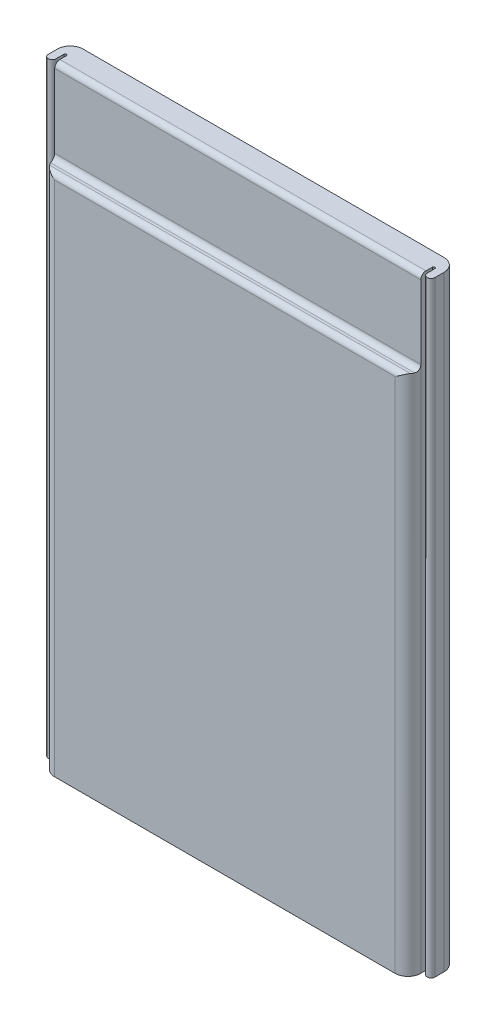
ISO-10303-21;
HEADER;
FILE_DESCRIPTION(('STEP AP214'),'2;1');
FILE_NAME('part.step','',(''),(''),'','','');
FILE_SCHEMA(('AUTOMOTIVE_DESIGN { 1 0 10303 214 1 1 1 1 }'));
ENDSEC;
DATA;
#1=APPLICATION_CONTEXT('core data for automotive mechanical design processes');
#2=APPLICATION_PROTOCOL_DEFINITION('international standard','automotive_design',2000,#1);
#3=PRODUCT_CONTEXT('',#1,'mechanical');
#4=PRODUCT('Part','Part','',(#3));
#5=PRODUCT_RELATED_PRODUCT_CATEGORY('part','',(#4));
#6=PRODUCT_DEFINITION_FORMATION('','',#4);
#7=PRODUCT_DEFINITION_CONTEXT('part definition',#1,'design');
#8=PRODUCT_DEFINITION('design','',#6,#7);
#9=PRODUCT_DEFINITION_SHAPE('','',#8);
#10=(LENGTH_UNIT() NAMED_UNIT(*) SI_UNIT(.MILLI.,.METRE.));
#11=(NAMED_UNIT(*) PLANE_ANGLE_UNIT() SI_UNIT($,.RADIAN.));
#12=(NAMED_UNIT(*) SI_UNIT($,.STERADIAN.) SOLID_ANGLE_UNIT());
#13=UNCERTAINTY_MEASURE_WITH_UNIT(LENGTH_MEASURE(1.E-05),#10,'distance_accuracy_value','');
#14=(GEOMETRIC_REPRESENTATION_CONTEXT(3) GLOBAL_UNCERTAINTY_ASSIGNED_CONTEXT((#13)) GLOBAL_UNIT_ASSIGNED_CONTEXT((#10,
#11,#12)) REPRESENTATION_CONTEXT('',''));
#15=CARTESIAN_POINT('',(0.,0.,0.));
#16=DIRECTION('',(0.,0.,1.));
#17=DIRECTION('',(1.,0.,0.));
#18=AXIS2_PLACEMENT_3D('',#15,#16,#17);
#19=CARTESIAN_POINT('',(-14.2,23.5,2.));
#20=DIRECTION('',(1.,0.,0.));
#21=DIRECTION('',(0.,0.,-1.));
#22=AXIS2_PLACEMENT_3D('',#19,#20,#21);
#23=PLANE('',#22);
#24=CARTESIAN_POINT('',(-14.2,23.1,1.6));
#25=DIRECTION('',(1.,0.,0.));
#26=DIRECTION('',(0.,0.,-1.));
#27=AXIS2_PLACEMENT_3D('',#24,#25,#26);
#28=CIRCLE('',#27,0.400000000000001);
#29=CARTESIAN_POINT('',(-14.2,23.5,1.6));
#30=VERTEX_POINT('',#29);
#31=CARTESIAN_POINT('',(-14.2,23.1,2.));
#32=VERTEX_POINT('',#31);
#33=EDGE_CURVE('E452',#30,#32,#28,.T.);
#34=ORIENTED_EDGE('',*,*,#33,.F.);
#35=DIRECTION('',(0.,0.,1.));
#36=VECTOR('',#35,1.);
#37=CARTESIAN_POINT('',(-14.2,23.5,2.));
#38=LINE('',#37,#36);
#39=CARTESIAN_POINT('',(-14.2,23.5,1.1));
#40=VERTEX_POINT('',#39);
#41=EDGE_CURVE('E268',#40,#30,#38,.T.);
#42=ORIENTED_EDGE('',*,*,#41,.F.);
#43=DIRECTION('',(0.,-1.,0.));
#44=VECTOR('',#43,1.);
#45=CARTESIAN_POINT('',(-14.2,23.5,1.1));
#46=LINE('',#45,#44);
#47=CARTESIAN_POINT('',(-14.2,-23.5,1.1));
#48=VERTEX_POINT('',#47);
#49=EDGE_CURVE('E236',#40,#48,#46,.T.);
#50=ORIENTED_EDGE('',*,*,#49,.T.);
#51=DIRECTION('',(0.,0.,1.));
#52=VECTOR('',#51,1.);
#53=CARTESIAN_POINT('',(-14.2,-23.5,2.));
#54=LINE('',#53,#52);
#55=CARTESIAN_POINT('',(-14.2,-23.5,2.));
#56=VERTEX_POINT('',#55);
#57=EDGE_CURVE('E191',#48,#56,#54,.T.);
#58=ORIENTED_EDGE('',*,*,#57,.T.);
#59=DIRECTION('',(0.,-1.,0.));
#60=VECTOR('',#59,1.);
#61=CARTESIAN_POINT('',(-14.2,23.5,2.));
#62=LINE('',#61,#60);
#63=CARTESIAN_POINT('',(-14.2,17.4,2.));
#64=VERTEX_POINT('',#63);
#65=EDGE_CURVE('E234',#64,#56,#62,.T.);
#66=ORIENTED_EDGE('',*,*,#65,.F.);
#67=DIRECTION('',(0.,-1.,0.));
#68=VECTOR('',#67,1.);
#69=CARTESIAN_POINT('',(-14.2,23.5,2.));
#70=LINE('',#69,#68);
#71=EDGE_CURVE('E435',#32,#64,#70,.T.);
#72=ORIENTED_EDGE('',*,*,#71,.F.);
#73=EDGE_LOOP('',(#34,#42,#50,#58,#66,#72));
#74=FACE_BOUND('',#73,.T.);
#75=ADVANCED_FACE('F35',(#74),#23,.F.);
#76=CARTESIAN_POINT('',(-13.2,23.5,2.));
#77=DIRECTION('',(0.,-1.,0.));
#78=DIRECTION('',(0.,0.,-1.));
#79=AXIS2_PLACEMENT_3D('',#76,#77,#78);
#80=CYLINDRICAL_SURFACE('',#79,0.999999999999999);
#81=CARTESIAN_POINT('',(-14.2,17.4,2.));
#82=CARTESIAN_POINT('',(-14.1999784790592,17.3775325233535,1.99998093151565));
#83=CARTESIAN_POINT('',(-14.1999996336532,17.355070373881,2.00189182556233));
#84=CARTESIAN_POINT('',(-14.1999682937054,17.3107904412264,2.00943417123763));
#85=CARTESIAN_POINT('',(-14.1999158358345,17.2889723427291,2.01506376960551));
#86=CARTESIAN_POINT('',(-14.1995784701462,17.2465785727421,2.0299086262157));
#87=CARTESIAN_POINT('',(-14.199293430335,17.2260036138756,2.03912591897356));
#88=CARTESIAN_POINT('',(-14.1982051175686,17.1867020384617,2.0608718750226));
#89=CARTESIAN_POINT('',(-14.1974019279033,17.1679751254084,2.07340000592295));
#90=CARTESIAN_POINT('',(-14.1949539279456,17.1330328543871,2.10129448001162));
#91=CARTESIAN_POINT('',(-14.1933147225489,17.1168016954871,2.11664149165532));
#92=CARTESIAN_POINT('',(-14.1888687841062,17.0871864353159,2.14972019250299));
#93=CARTESIAN_POINT('',(-14.1860625763994,17.073801057077,2.16745080627447));
#94=CARTESIAN_POINT('',(-14.1791087346078,17.0505573373619,2.20416996949275));
#95=CARTESIAN_POINT('',(-14.1749991196537,17.0406139847208,2.2231119924044));
#96=CARTESIAN_POINT('',(-14.1652718349022,17.0239573871511,2.26201544015337));
#97=CARTESIAN_POINT('',(-14.1596534618078,17.0172456527044,2.28197733687485));
#98=CARTESIAN_POINT('',(-14.1481024176326,17.008044007862,2.31842546140316));
#99=CARTESIAN_POINT('',(-14.142428651973,17.0049967480144,2.33485751705032));
#100=CARTESIAN_POINT('',(-14.1301533751173,17.0009729837141,2.36759286116685));
#101=CARTESIAN_POINT('',(-14.1235537162305,16.9999924059977,2.38389633971359));
#102=CARTESIAN_POINT('',(-14.1165151389912,17.,2.4));
#103=B_SPLINE_CURVE_WITH_KNOTS('',3,(#81,#82,#83,#84,#85,#86,#87,#88,#89,#90,#91,#92,#93,#94,
#95,#96,#97,#98,#99,#100,#101,#102),.UNSPECIFIED.,.F.,.F.,(4,2,2,2,2,2,2,2,2,2,4),(0.,
0.0673138199880915,0.13459411861319,0.201912626376012,0.269220315738881,0.336082572906076,
0.402914763806316,0.467953461113571,0.533022528539236,0.585825359497232,0.638524022644764),.UNSPECIFIED.);
#104=CARTESIAN_POINT('',(-14.1165151389912,17.,2.4));
#105=VERTEX_POINT('',#104);
#106=EDGE_CURVE('E432',#64,#105,#103,.T.);
#107=ORIENTED_EDGE('',*,*,#106,.F.);
#108=ORIENTED_EDGE('',*,*,#65,.T.);
#109=CARTESIAN_POINT('',(-13.2,-23.5,2.));
#110=DIRECTION('',(0.,1.,0.));
#111=DIRECTION('',(0.,0.,1.));
#112=AXIS2_PLACEMENT_3D('',#109,#110,#111);
#113=CIRCLE('',#112,0.999999999999999);
#114=CARTESIAN_POINT('',(-13.2,-23.5,3.));
#115=VERTEX_POINT('',#114);
#116=EDGE_CURVE('E194',#56,#115,#113,.T.);
#117=ORIENTED_EDGE('',*,*,#116,.T.);
#118=DIRECTION('',(0.,-1.,0.));
#119=VECTOR('',#118,1.);
#120=CARTESIAN_POINT('',(-13.2,23.5,3.));
#121=LINE('',#120,#119);
#122=CARTESIAN_POINT('',(-13.2,16.6,3.));
#123=VERTEX_POINT('',#122);
#124=EDGE_CURVE('E232',#123,#115,#121,.T.);
#125=ORIENTED_EDGE('',*,*,#124,.F.);
#126=CARTESIAN_POINT('',(-14.,17.,2.6));
#127=CARTESIAN_POINT('',(-13.9794655557852,16.999963502659,2.62742158688643));
#128=CARTESIAN_POINT('',(-13.9575983063105,16.997191577115,2.65360470949974));
#129=CARTESIAN_POINT('',(-13.9120003352025,16.9873375955562,2.70296457420721));
#130=CARTESIAN_POINT('',(-13.8882899283743,16.9802979548521,2.7261682126742));
#131=CARTESIAN_POINT('',(-13.8290059418007,16.9593597466306,2.77879996658453));
#132=CARTESIAN_POINT('',(-13.7926681124183,16.9438182116336,2.8066906262616));
#133=CARTESIAN_POINT('',(-13.7179101712106,16.9083623370661,2.85662413275789));
#134=CARTESIAN_POINT('',(-13.6794786197978,16.8884216722672,2.87862993057854));
#135=CARTESIAN_POINT('',(-13.5851954191672,16.8368522731022,2.92488471521433));
#136=CARTESIAN_POINT('',(-13.5287257947407,16.8038047508952,2.9462829915298));
#137=CARTESIAN_POINT('',(-13.41473104532,16.7349288005911,2.97846495796601));
#138=CARTESIAN_POINT('',(-13.3572080468761,16.6991055857253,2.98926805013529));
#139=CARTESIAN_POINT('',(-13.2681605265798,16.6431017838824,2.99817080641197));
#140=CARTESIAN_POINT('',(-13.2367509680314,16.6232429928823,2.99981786747483));
#141=CARTESIAN_POINT('',(-13.2035634732043,16.6022537396361,2.99999523668233));
#142=CARTESIAN_POINT('',(-13.2017817256956,16.6011268636092,2.99999999807848));
#143=CARTESIAN_POINT('',(-13.2,16.6,3.));
#144=B_SPLINE_CURVE_WITH_KNOTS('',3,(#126,#127,#128,#129,#130,#131,#132,#133,#134,#135,#136,
#137,#138,#139,#140,#141,#142,#143),.UNSPECIFIED.,.F.,.F.,(4,2,2,2,2,2,2,2,4),(0.,
0.102339866834816,0.203678917670562,0.348024697625987,0.493258904873185,0.6986898834407,
0.903743967608917,1.01522241349044,1.02154698494518),.UNSPECIFIED.);
#145=CARTESIAN_POINT('',(-14.,17.,2.6));
#146=VERTEX_POINT('',#145);
#147=EDGE_CURVE('E433',#146,#123,#144,.T.);
#148=ORIENTED_EDGE('',*,*,#147,.F.);
#149=CARTESIAN_POINT('',(-13.2,17.,2.));
#150=DIRECTION('',(0.,-1.,0.));
#151=DIRECTION('',(0.,0.,-1.));
#152=AXIS2_PLACEMENT_3D('',#149,#150,#151);
#153=CIRCLE('',#152,0.999999999999999);
#154=EDGE_CURVE('E426',#105,#146,#153,.F.);
#155=ORIENTED_EDGE('',*,*,#154,.F.);
#156=EDGE_LOOP('',(#107,#108,#117,#125,#148,#155));
#157=FACE_BOUND('',#156,.T.);
#158=ADVANCED_FACE('F360',(#157),#80,.T.);
#159=CARTESIAN_POINT('',(13.2,23.5,2.));
#160=DIRECTION('',(0.,-1.,0.));
#161=DIRECTION('',(0.,0.,-1.));
#162=AXIS2_PLACEMENT_3D('',#159,#160,#161);
#163=CYLINDRICAL_SURFACE('',#162,1.);
#164=CARTESIAN_POINT('',(14.2,17.4,2.));
#165=CARTESIAN_POINT('',(14.1999784790592,17.3775325233535,1.99998093151565));
#166=CARTESIAN_POINT('',(14.1999996336532,17.355070373881,2.00189182556233));
#167=CARTESIAN_POINT('',(14.1999682937054,17.3107904412264,2.00943417123763));
#168=CARTESIAN_POINT('',(14.1999158358345,17.2889723427291,2.01506376960551));
#169=CARTESIAN_POINT('',(14.1995784701462,17.2465785727421,2.0299086262157));
#170=CARTESIAN_POINT('',(14.199293430335,17.2260036138756,2.03912591897356));
#171=CARTESIAN_POINT('',(14.1982051175686,17.1867020384617,2.0608718750226));
#172=CARTESIAN_POINT('',(14.1974019279033,17.1679751254084,2.07340000592295));
#173=CARTESIAN_POINT('',(14.1949539279456,17.1330328543871,2.10129448001162));
#174=CARTESIAN_POINT('',(14.1933147225489,17.1168016954871,2.11664149165532));
#175=CARTESIAN_POINT('',(14.1888687841062,17.0871864353159,2.14972019250299));
#176=CARTESIAN_POINT('',(14.1860625763994,17.073801057077,2.16745080627447));
#177=CARTESIAN_POINT('',(14.1791087346078,17.0505573373619,2.20416996949274));
#178=CARTESIAN_POINT('',(14.1749991196537,17.0406139847208,2.2231119924044));
#179=CARTESIAN_POINT('',(14.1652718349022,17.0239573871511,2.26201544015337));
#180=CARTESIAN_POINT('',(14.1596534618078,17.0172456527044,2.28197733687485));
#181=CARTESIAN_POINT('',(14.1481024176326,17.008044007862,2.31842546140316));
#182=CARTESIAN_POINT('',(14.142428651973,17.0049967480144,2.33485751705032));
#183=CARTESIAN_POINT('',(14.1301533751173,17.0009729837141,2.36759286116685));
#184=CARTESIAN_POINT('',(14.1235537162305,16.9999924059977,2.38389633971359));
#185=CARTESIAN_POINT('',(14.1165151389912,17.,2.4));
#186=B_SPLINE_CURVE_WITH_KNOTS('',3,(#164,#165,#166,#167,#168,#169,#170,#171,#172,#173,#174,
#175,#176,#177,#178,#179,#180,#181,#182,#183,#184,#185),.UNSPECIFIED.,.F.,.F.,(4,2,2,2,2,2,2,2,
2,2,4),(0.,0.0673138199880915,0.13459411861319,0.201912626376012,0.269220315738881,
0.336082572906076,0.402914763806315,0.46795346111357,0.533022528539236,0.585825359497233,
0.638524022644765),.UNSPECIFIED.);
#187=CARTESIAN_POINT('',(14.2,17.4,2.));
#188=VERTEX_POINT('',#187);
#189=CARTESIAN_POINT('',(14.1165151389912,17.,2.4));
#190=VERTEX_POINT('',#189);
#191=EDGE_CURVE('E339',#188,#190,#186,.T.);
#192=ORIENTED_EDGE('',*,*,#191,.T.);
#193=CARTESIAN_POINT('',(13.2,17.,2.));
#194=DIRECTION('',(0.,1.,0.));
#195=DIRECTION('',(0.,0.,1.));
#196=AXIS2_PLACEMENT_3D('',#193,#194,#195);
#197=CIRCLE('',#196,1.);
#198=CARTESIAN_POINT('',(14.,17.,2.6));
#199=VERTEX_POINT('',#198);
#200=EDGE_CURVE('E325',#190,#199,#197,.F.);
#201=ORIENTED_EDGE('',*,*,#200,.T.);
#202=CARTESIAN_POINT('',(14.,17.,2.6));
#203=CARTESIAN_POINT('',(13.9794655557852,16.999963502659,2.62742158688643));
#204=CARTESIAN_POINT('',(13.9575983063105,16.997191577115,2.65360470949975));
#205=CARTESIAN_POINT('',(13.9120003352025,16.9873375955562,2.70296457420721));
#206=CARTESIAN_POINT('',(13.8882899283743,16.9802979548521,2.7261682126742));
#207=CARTESIAN_POINT('',(13.8290059418007,16.9593597466306,2.77879996658453));
#208=CARTESIAN_POINT('',(13.7926681124183,16.9438182116336,2.80669062626159));
#209=CARTESIAN_POINT('',(13.7179101712106,16.9083623370661,2.85662413275788));
#210=CARTESIAN_POINT('',(13.6794786197978,16.8884216722672,2.87862993057853));
#211=CARTESIAN_POINT('',(13.5851954191672,16.8368522731022,2.92488471521433));
#212=CARTESIAN_POINT('',(13.5287257947408,16.8038047508951,2.9462829915298));
#213=CARTESIAN_POINT('',(13.4147310453199,16.7349288005912,2.97846495796601));
#214=CARTESIAN_POINT('',(13.3572080468759,16.6991055857257,2.98926805013529));
#215=CARTESIAN_POINT('',(13.26816052658,16.6431017838822,2.99817080641197));
#216=CARTESIAN_POINT('',(13.2367509680318,16.6232429928817,2.99981786747484));
#217=CARTESIAN_POINT('',(13.2035634732044,16.602253739636,2.99999523668233));
#218=CARTESIAN_POINT('',(13.2017817256956,16.6011268636092,2.99999999807848));
#219=CARTESIAN_POINT('',(13.2,16.6,3.));
#220=B_SPLINE_CURVE_WITH_KNOTS('',3,(#202,#203,#204,#205,#206,#207,#208,#209,#210,#211,#212,
#213,#214,#215,#216,#217,#218,#219),.UNSPECIFIED.,.F.,.F.,(4,2,2,2,2,2,2,2,4),(0.,
0.102339866834826,0.203678917670562,0.348024697625976,0.493258904873184,0.698689883440705,
0.903743967608914,1.01522241349045,1.02154698494518),.UNSPECIFIED.);
#221=CARTESIAN_POINT('',(13.2,16.6,3.));
#222=VERTEX_POINT('',#221);
#223=EDGE_CURVE('E316',#199,#222,#220,.T.);
#224=ORIENTED_EDGE('',*,*,#223,.T.);
#225=DIRECTION('',(0.,-1.,0.));
#226=VECTOR('',#225,1.);
#227=CARTESIAN_POINT('',(13.2,23.5,3.));
#228=LINE('',#227,#226);
#229=CARTESIAN_POINT('',(13.2,-23.5,3.));
#230=VERTEX_POINT('',#229);
#231=EDGE_CURVE('E230',#222,#230,#228,.T.);
#232=ORIENTED_EDGE('',*,*,#231,.T.);
#233=CARTESIAN_POINT('',(13.2,-23.5,2.));
#234=DIRECTION('',(0.,1.,0.));
#235=DIRECTION('',(0.,0.,-1.));
#236=AXIS2_PLACEMENT_3D('',#233,#234,#235);
#237=CIRCLE('',#236,1.);
#238=CARTESIAN_POINT('',(14.2,-23.5,2.));
#239=VERTEX_POINT('',#238);
#240=EDGE_CURVE('E200',#230,#239,#237,.T.);
#241=ORIENTED_EDGE('',*,*,#240,.T.);
#242=DIRECTION('',(0.,-1.,0.));
#243=VECTOR('',#242,1.);
#244=CARTESIAN_POINT('',(14.2,23.5,2.));
#245=LINE('',#244,#243);
#246=EDGE_CURVE('E228',#188,#239,#245,.T.);
#247=ORIENTED_EDGE('',*,*,#246,.F.);
#248=EDGE_LOOP('',(#192,#201,#224,#232,#241,#247));
#249=FACE_BOUND('',#248,.T.);
#250=ADVANCED_FACE('F366',(#249),#163,.T.);
#251=CARTESIAN_POINT('',(14.2,23.5,1.1));
#252=DIRECTION('',(-1.,0.,0.));
#253=DIRECTION('',(0.,0.,1.));
#254=AXIS2_PLACEMENT_3D('',#251,#252,#253);
#255=PLANE('',#254);
#256=CARTESIAN_POINT('',(14.2,23.1,1.6));
#257=DIRECTION('',(-1.,0.,0.));
#258=DIRECTION('',(0.,0.,1.));
#259=AXIS2_PLACEMENT_3D('',#256,#257,#258);
#260=CIRCLE('',#259,0.400000000000001);
#261=CARTESIAN_POINT('',(14.2,23.5,1.6));
#262=VERTEX_POINT('',#261);
#263=CARTESIAN_POINT('',(14.2,23.1,2.));
#264=VERTEX_POINT('',#263);
#265=EDGE_CURVE('E50',#262,#264,#260,.F.);
#266=ORIENTED_EDGE('',*,*,#265,.T.);
#267=DIRECTION('',(0.,-1.,0.));
#268=VECTOR('',#267,1.);
#269=CARTESIAN_POINT('',(14.2,23.1,2.));
#270=LINE('',#269,#268);
#271=EDGE_CURVE('E183',#264,#188,#270,.T.);
#272=ORIENTED_EDGE('',*,*,#271,.T.);
#273=ORIENTED_EDGE('',*,*,#246,.T.);
#274=DIRECTION('',(0.,0.,-1.));
#275=VECTOR('',#274,1.);
#276=CARTESIAN_POINT('',(14.2,-23.5,1.1));
#277=LINE('',#276,#275);
#278=CARTESIAN_POINT('',(14.2,-23.5,1.1));
#279=VERTEX_POINT('',#278);
#280=EDGE_CURVE('E203',#239,#279,#277,.T.);
#281=ORIENTED_EDGE('',*,*,#280,.T.);
#282=DIRECTION('',(0.,-1.,0.));
#283=VECTOR('',#282,1.);
#284=CARTESIAN_POINT('',(14.2,23.5,1.1));
#285=LINE('',#284,#283);
#286=CARTESIAN_POINT('',(14.2,23.5,1.1));
#287=VERTEX_POINT('',#286);
#288=EDGE_CURVE('E225',#287,#279,#285,.T.);
#289=ORIENTED_EDGE('',*,*,#288,.F.);
#290=DIRECTION('',(0.,0.,-1.));
#291=VECTOR('',#290,1.);
#292=CARTESIAN_POINT('',(14.2,23.5,1.1));
#293=LINE('',#292,#291);
#294=EDGE_CURVE('E271',#262,#287,#293,.T.);
#295=ORIENTED_EDGE('',*,*,#294,.F.);
#296=EDGE_LOOP('',(#266,#272,#273,#281,#289,#295));
#297=FACE_BOUND('',#296,.T.);
#298=ADVANCED_FACE('F383',(#297),#255,.F.);
#299=CARTESIAN_POINT('',(-14.,23.5,0.999999999999998));
#300=DIRECTION('',(0.,-1.,0.));
#301=DIRECTION('',(0.,0.,-1.));
#302=AXIS2_PLACEMENT_3D('',#299,#300,#301);
#303=CYLINDRICAL_SURFACE('',#302,1.);
#304=CARTESIAN_POINT('',(-14.,-23.5,0.999999999999998));
#305=DIRECTION('',(0.,1.,0.));
#306=DIRECTION('',(0.,0.,1.));
#307=AXIS2_PLACEMENT_3D('',#304,#305,#306);
#308=CIRCLE('',#307,1.);
#309=CARTESIAN_POINT('',(-14.,-23.5,0.));
#310=VERTEX_POINT('',#309);
#311=CARTESIAN_POINT('',(-15.,-23.5,1.));
#312=VERTEX_POINT('',#311);
#313=EDGE_CURVE('E179',#310,#312,#308,.T.);
#314=ORIENTED_EDGE('',*,*,#313,.T.);
#315=DIRECTION('',(0.,-1.,0.));
#316=VECTOR('',#315,1.);
#317=CARTESIAN_POINT('',(-15.,23.5,1.));
#318=LINE('',#317,#316);
#319=CARTESIAN_POINT('',(-15.,23.5,1.));
#320=VERTEX_POINT('',#319);
#321=EDGE_CURVE('E11',#320,#312,#318,.T.);
#322=ORIENTED_EDGE('',*,*,#321,.F.);
#323=CARTESIAN_POINT('',(-14.,23.5,0.999999999999998));
#324=DIRECTION('',(0.,1.,0.));
#325=DIRECTION('',(0.,0.,1.));
#326=AXIS2_PLACEMENT_3D('',#323,#324,#325);
#327=CIRCLE('',#326,1.);
#328=CARTESIAN_POINT('',(-14.,23.5,0.));
#329=VERTEX_POINT('',#328);
#330=EDGE_CURVE('E215',#329,#320,#327,.T.);
#331=ORIENTED_EDGE('',*,*,#330,.F.);
#332=DIRECTION('',(0.,-1.,0.));
#333=VECTOR('',#332,1.);
#334=CARTESIAN_POINT('',(-14.,23.5,0.));
#335=LINE('',#334,#333);
#336=EDGE_CURVE('E175',#329,#310,#335,.T.);
#337=ORIENTED_EDGE('',*,*,#336,.T.);
#338=EDGE_LOOP('',(#314,#322,#331,#337));
#339=FACE_BOUND('',#338,.T.);
#340=ADVANCED_FACE('F37',(#339),#303,.T.);
#341=CARTESIAN_POINT('',(-15.,23.5,1.));
#342=DIRECTION('',(1.,0.,0.));
#343=DIRECTION('',(0.,0.,-1.));
#344=AXIS2_PLACEMENT_3D('',#341,#342,#343);
#345=PLANE('',#344);
#346=DIRECTION('',(0.,0.,1.));
#347=VECTOR('',#346,1.);
#348=CARTESIAN_POINT('',(-15.,-23.5,1.));
#349=LINE('',#348,#347);
#350=CARTESIAN_POINT('',(-15.,-23.5,1.7));
#351=VERTEX_POINT('',#350);
#352=EDGE_CURVE('E182',#312,#351,#349,.T.);
#353=ORIENTED_EDGE('',*,*,#352,.T.);
#354=DIRECTION('',(0.,-1.,0.));
#355=VECTOR('',#354,1.);
#356=CARTESIAN_POINT('',(-15.,23.5,1.7));
#357=LINE('',#356,#355);
#358=CARTESIAN_POINT('',(-15.,23.5,1.7));
#359=VERTEX_POINT('',#358);
#360=EDGE_CURVE('E43',#359,#351,#357,.T.);
#361=ORIENTED_EDGE('',*,*,#360,.F.);
#362=DIRECTION('',(0.,0.,1.));
#363=VECTOR('',#362,1.);
#364=CARTESIAN_POINT('',(-15.,23.5,1.));
#365=LINE('',#364,#363);
#366=EDGE_CURVE('E124',#320,#359,#365,.T.);
#367=ORIENTED_EDGE('',*,*,#366,.F.);
#368=ORIENTED_EDGE('',*,*,#321,.T.);
#369=EDGE_LOOP('',(#353,#361,#367,#368));
#370=FACE_BOUND('',#369,.T.);
#371=ADVANCED_FACE('F378',(#370),#345,.F.);
#372=CARTESIAN_POINT('',(-14.7,23.5,1.7));
#373=DIRECTION('',(0.,-1.,0.));
#374=DIRECTION('',(0.,0.,-1.));
#375=AXIS2_PLACEMENT_3D('',#372,#373,#374);
#376=CYLINDRICAL_SURFACE('',#375,0.299999999999998);
#377=CARTESIAN_POINT('',(-14.7,-23.5,1.7));
#378=DIRECTION('',(0.,1.,0.));
#379=DIRECTION('',(0.,0.,1.));
#380=AXIS2_PLACEMENT_3D('',#377,#378,#379);
#381=CIRCLE('',#380,0.299999999999998);
#382=CARTESIAN_POINT('',(-14.4,-23.5,1.7));
#383=VERTEX_POINT('',#382);
#384=EDGE_CURVE('E185',#351,#383,#381,.T.);
#385=ORIENTED_EDGE('',*,*,#384,.T.);
#386=DIRECTION('',(0.,-1.,0.));
#387=VECTOR('',#386,1.);
#388=CARTESIAN_POINT('',(-14.4,23.5,1.7));
#389=LINE('',#388,#387);
#390=CARTESIAN_POINT('',(-14.4,23.5,1.7));
#391=VERTEX_POINT('',#390);
#392=EDGE_CURVE('E242',#391,#383,#389,.T.);
#393=ORIENTED_EDGE('',*,*,#392,.F.);
#394=CARTESIAN_POINT('',(-14.7,23.5,1.7));
#395=DIRECTION('',(0.,1.,0.));
#396=DIRECTION('',(0.,0.,1.));
#397=AXIS2_PLACEMENT_3D('',#394,#395,#396);
#398=CIRCLE('',#397,0.299999999999998);
#399=EDGE_CURVE('E250',#359,#391,#398,.T.);
#400=ORIENTED_EDGE('',*,*,#399,.F.);
#401=ORIENTED_EDGE('',*,*,#360,.T.);
#402=EDGE_LOOP('',(#385,#393,#400,#401));
#403=FACE_BOUND('',#402,.T.);
#404=ADVANCED_FACE('F248',(#403),#376,.T.);
#405=CARTESIAN_POINT('',(-14.4,23.5,1.7));
#406=DIRECTION('',(-1.,0.,0.));
#407=DIRECTION('',(0.,0.,1.));
#408=AXIS2_PLACEMENT_3D('',#405,#406,#407);
#409=PLANE('',#408);
#410=DIRECTION('',(0.,0.,-1.));
#411=VECTOR('',#410,1.);
#412=CARTESIAN_POINT('',(-14.4,-23.5,1.7));
#413=LINE('',#412,#411);
#414=CARTESIAN_POINT('',(-14.4,-23.5,1.1));
#415=VERTEX_POINT('',#414);
#416=EDGE_CURVE('E187',#383,#415,#413,.T.);
#417=ORIENTED_EDGE('',*,*,#416,.T.);
#418=DIRECTION('',(0.,-1.,0.));
#419=VECTOR('',#418,1.);
#420=CARTESIAN_POINT('',(-14.4,23.5,1.1));
#421=LINE('',#420,#419);
#422=CARTESIAN_POINT('',(-14.4,23.5,1.1));
#423=VERTEX_POINT('',#422);
#424=EDGE_CURVE('E239',#423,#415,#421,.T.);
#425=ORIENTED_EDGE('',*,*,#424,.F.);
#426=DIRECTION('',(0.,0.,-1.));
#427=VECTOR('',#426,1.);
#428=CARTESIAN_POINT('',(-14.4,23.5,1.7));
#429=LINE('',#428,#427);
#430=EDGE_CURVE('E269',#391,#423,#429,.T.);
#431=ORIENTED_EDGE('',*,*,#430,.F.);
#432=ORIENTED_EDGE('',*,*,#392,.T.);
#433=EDGE_LOOP('',(#417,#425,#431,#432));
#434=FACE_BOUND('',#433,.T.);
#435=ADVANCED_FACE('F259',(#434),#409,.F.);
#436=CARTESIAN_POINT('',(-14.3,23.5,1.1));
#437=DIRECTION('',(0.,-1.,0.));
#438=DIRECTION('',(0.,0.,-1.));
#439=AXIS2_PLACEMENT_3D('',#436,#437,#438);
#440=CYLINDRICAL_SURFACE('',#439,0.100000000000001);
#441=CARTESIAN_POINT('',(-14.3,-23.5,1.1));
#442=DIRECTION('',(0.,-1.,0.));
#443=DIRECTION('',(0.,0.,1.));
#444=AXIS2_PLACEMENT_3D('',#441,#442,#443);
#445=CIRCLE('',#444,0.100000000000001);
#446=EDGE_CURVE('E189',#415,#48,#445,.T.);
#447=ORIENTED_EDGE('',*,*,#446,.T.);
#448=ORIENTED_EDGE('',*,*,#49,.F.);
#449=CARTESIAN_POINT('',(-14.3,23.5,1.1));
#450=DIRECTION('',(0.,-1.,0.));
#451=DIRECTION('',(0.,0.,1.));
#452=AXIS2_PLACEMENT_3D('',#449,#450,#451);
#453=CIRCLE('',#452,0.100000000000001);
#454=EDGE_CURVE('E265',#423,#40,#453,.T.);
#455=ORIENTED_EDGE('',*,*,#454,.F.);
#456=ORIENTED_EDGE('',*,*,#424,.T.);
#457=EDGE_LOOP('',(#447,#448,#455,#456));
#458=FACE_BOUND('',#457,.T.);
#459=ADVANCED_FACE('F263',(#458),#440,.F.);
#460=CARTESIAN_POINT('',(-13.2,23.5,3.));
#461=DIRECTION('',(0.,0.,-1.));
#462=DIRECTION('',(-1.,0.,0.));
#463=AXIS2_PLACEMENT_3D('',#460,#461,#462);
#464=PLANE('',#463);
#465=ORIENTED_EDGE('',*,*,#231,.F.);
#466=DIRECTION('',(-1.,0.,0.));
#467=VECTOR('',#466,1.);
#468=CARTESIAN_POINT('',(15.001,16.6,3.));
#469=LINE('',#468,#467);
#470=EDGE_CURVE('E301',#222,#123,#469,.T.);
#471=ORIENTED_EDGE('',*,*,#470,.T.);
#472=ORIENTED_EDGE('',*,*,#124,.T.);
#473=DIRECTION('',(1.,0.,0.));
#474=VECTOR('',#473,1.);
#475=CARTESIAN_POINT('',(-13.2,-23.5,3.));
#476=LINE('',#475,#474);
#477=EDGE_CURVE('E197',#115,#230,#476,.T.);
#478=ORIENTED_EDGE('',*,*,#477,.T.);
#479=EDGE_LOOP('',(#465,#471,#472,#478));
#480=FACE_BOUND('',#479,.T.);
#481=ADVANCED_FACE('F374',(#480),#464,.F.);
#482=CARTESIAN_POINT('',(14.3,23.5,1.1));
#483=DIRECTION('',(0.,-1.,0.));
#484=DIRECTION('',(0.,0.,-1.));
#485=AXIS2_PLACEMENT_3D('',#482,#483,#484);
#486=CYLINDRICAL_SURFACE('',#485,0.0999999999999977);
#487=CARTESIAN_POINT('',(14.3,-23.5,1.1));
#488=DIRECTION('',(0.,-1.,0.));
#489=DIRECTION('',(0.,0.,-1.));
#490=AXIS2_PLACEMENT_3D('',#487,#488,#489);
#491=CIRCLE('',#490,0.0999999999999977);
#492=CARTESIAN_POINT('',(14.4,-23.5,1.1));
#493=VERTEX_POINT('',#492);
#494=EDGE_CURVE('E205',#279,#493,#491,.T.);
#495=ORIENTED_EDGE('',*,*,#494,.T.);
#496=DIRECTION('',(0.,-1.,0.));
#497=VECTOR('',#496,1.);
#498=CARTESIAN_POINT('',(14.4,23.5,1.1));
#499=LINE('',#498,#497);
#500=CARTESIAN_POINT('',(14.4,23.5,1.1));
#501=VERTEX_POINT('',#500);
#502=EDGE_CURVE('E222',#501,#493,#499,.T.);
#503=ORIENTED_EDGE('',*,*,#502,.F.);
#504=CARTESIAN_POINT('',(14.3,23.5,1.1));
#505=DIRECTION('',(0.,-1.,0.));
#506=DIRECTION('',(0.,0.,-1.));
#507=AXIS2_PLACEMENT_3D('',#504,#505,#506);
#508=CIRCLE('',#507,0.0999999999999977);
#509=EDGE_CURVE('E277',#287,#501,#508,.T.);
#510=ORIENTED_EDGE('',*,*,#509,.F.);
#511=ORIENTED_EDGE('',*,*,#288,.T.);
#512=EDGE_LOOP('',(#495,#503,#510,#511));
#513=FACE_BOUND('',#512,.T.);
#514=ADVANCED_FACE('F395',(#513),#486,.F.);
#515=CARTESIAN_POINT('',(14.4,23.5,1.70000000000001));
#516=DIRECTION('',(1.,0.,0.));
#517=DIRECTION('',(0.,0.,-1.));
#518=AXIS2_PLACEMENT_3D('',#515,#516,#517);
#519=PLANE('',#518);
#520=DIRECTION('',(0.,0.,1.));
#521=VECTOR('',#520,1.);
#522=CARTESIAN_POINT('',(14.4,-23.5,1.70000000000001));
#523=LINE('',#522,#521);
#524=CARTESIAN_POINT('',(14.4,-23.5,1.70000000000001));
#525=VERTEX_POINT('',#524);
#526=EDGE_CURVE('E207',#493,#525,#523,.T.);
#527=ORIENTED_EDGE('',*,*,#526,.T.);
#528=DIRECTION('',(0.,-1.,0.));
#529=VECTOR('',#528,1.);
#530=CARTESIAN_POINT('',(14.4,23.5,1.70000000000001));
#531=LINE('',#530,#529);
#532=CARTESIAN_POINT('',(14.4,23.5,1.70000000000001));
#533=VERTEX_POINT('',#532);
#534=EDGE_CURVE('E219',#533,#525,#531,.T.);
#535=ORIENTED_EDGE('',*,*,#534,.F.);
#536=DIRECTION('',(0.,0.,1.));
#537=VECTOR('',#536,1.);
#538=CARTESIAN_POINT('',(14.4,23.5,1.70000000000001));
#539=LINE('',#538,#537);
#540=EDGE_CURVE('E279',#501,#533,#539,.T.);
#541=ORIENTED_EDGE('',*,*,#540,.F.);
#542=ORIENTED_EDGE('',*,*,#502,.T.);
#543=EDGE_LOOP('',(#527,#535,#541,#542));
#544=FACE_BOUND('',#543,.T.);
#545=ADVANCED_FACE('F285',(#544),#519,.F.);
#546=CARTESIAN_POINT('',(14.7,23.5,1.70000000000001));
#547=DIRECTION('',(0.,-1.,0.));
#548=DIRECTION('',(0.,0.,-1.));
#549=AXIS2_PLACEMENT_3D('',#546,#547,#548);
#550=CYLINDRICAL_SURFACE('',#549,0.300000000000009);
#551=CARTESIAN_POINT('',(14.7,-23.5,1.70000000000001));
#552=DIRECTION('',(0.,1.,0.));
#553=DIRECTION('',(0.,0.,-1.));
#554=AXIS2_PLACEMENT_3D('',#551,#552,#553);
#555=CIRCLE('',#554,0.300000000000009);
#556=CARTESIAN_POINT('',(15.,-23.5,1.70000000000001));
#557=VERTEX_POINT('',#556);
#558=EDGE_CURVE('E209',#525,#557,#555,.T.);
#559=ORIENTED_EDGE('',*,*,#558,.T.);
#560=DIRECTION('',(0.,-1.,0.));
#561=VECTOR('',#560,1.);
#562=CARTESIAN_POINT('',(15.,23.5,1.70000000000001));
#563=LINE('',#562,#561);
#564=CARTESIAN_POINT('',(15.,23.5,1.70000000000001));
#565=VERTEX_POINT('',#564);
#566=EDGE_CURVE('E170',#565,#557,#563,.T.);
#567=ORIENTED_EDGE('',*,*,#566,.F.);
#568=CARTESIAN_POINT('',(14.7,23.5,1.70000000000001));
#569=DIRECTION('',(0.,1.,0.));
#570=DIRECTION('',(0.,0.,-1.));
#571=AXIS2_PLACEMENT_3D('',#568,#569,#570);
#572=CIRCLE('',#571,0.300000000000009);
#573=EDGE_CURVE('E158',#533,#565,#572,.T.);
#574=ORIENTED_EDGE('',*,*,#573,.F.);
#575=ORIENTED_EDGE('',*,*,#534,.T.);
#576=EDGE_LOOP('',(#559,#567,#574,#575));
#577=FACE_BOUND('',#576,.T.);
#578=ADVANCED_FACE('F289',(#577),#550,.T.);
#579=CARTESIAN_POINT('',(15.,23.5,1.));
#580=DIRECTION('',(-1.,0.,0.));
#581=DIRECTION('',(0.,0.,1.));
#582=AXIS2_PLACEMENT_3D('',#579,#580,#581);
#583=PLANE('',#582);
#584=DIRECTION('',(0.,0.,-1.));
#585=VECTOR('',#584,1.);
#586=CARTESIAN_POINT('',(15.,-23.5,1.));
#587=LINE('',#586,#585);
#588=CARTESIAN_POINT('',(15.,-23.5,1.));
#589=VERTEX_POINT('',#588);
#590=EDGE_CURVE('E167',#557,#589,#587,.T.);
#591=ORIENTED_EDGE('',*,*,#590,.T.);
#592=DIRECTION('',(0.,-1.,0.));
#593=VECTOR('',#592,1.);
#594=CARTESIAN_POINT('',(15.,23.5,1.));
#595=LINE('',#594,#593);
#596=CARTESIAN_POINT('',(15.,23.5,1.));
#597=VERTEX_POINT('',#596);
#598=EDGE_CURVE('E164',#597,#589,#595,.T.);
#599=ORIENTED_EDGE('',*,*,#598,.F.);
#600=DIRECTION('',(0.,0.,-1.));
#601=VECTOR('',#600,1.);
#602=CARTESIAN_POINT('',(15.,23.5,1.));
#603=LINE('',#602,#601);
#604=EDGE_CURVE('E151',#565,#597,#603,.T.);
#605=ORIENTED_EDGE('',*,*,#604,.F.);
#606=ORIENTED_EDGE('',*,*,#566,.T.);
#607=EDGE_LOOP('',(#591,#599,#605,#606));
#608=FACE_BOUND('',#607,.T.);
#609=ADVANCED_FACE('F165',(#608),#583,.F.);
#610=CARTESIAN_POINT('',(14.,23.5,1.));
#611=DIRECTION('',(0.,-1.,0.));
#612=DIRECTION('',(0.,0.,-1.));
#613=AXIS2_PLACEMENT_3D('',#610,#611,#612);
#614=CYLINDRICAL_SURFACE('',#613,1.);
#615=CARTESIAN_POINT('',(14.,-23.5,1.));
#616=DIRECTION('',(0.,1.,0.));
#617=DIRECTION('',(0.,0.,-1.));
#618=AXIS2_PLACEMENT_3D('',#615,#616,#617);
#619=CIRCLE('',#618,1.);
#620=CARTESIAN_POINT('',(14.,-23.5,0.));
#621=VERTEX_POINT('',#620);
#622=EDGE_CURVE('E212',#589,#621,#619,.T.);
#623=ORIENTED_EDGE('',*,*,#622,.T.);
#624=DIRECTION('',(0.,-1.,0.));
#625=VECTOR('',#624,1.);
#626=CARTESIAN_POINT('',(14.,23.5,0.));
#627=LINE('',#626,#625);
#628=CARTESIAN_POINT('',(14.,23.5,0.));
#629=VERTEX_POINT('',#628);
#630=EDGE_CURVE('E171',#629,#621,#627,.T.);
#631=ORIENTED_EDGE('',*,*,#630,.F.);
#632=CARTESIAN_POINT('',(14.,23.5,1.));
#633=DIRECTION('',(0.,1.,0.));
#634=DIRECTION('',(0.,0.,-1.));
#635=AXIS2_PLACEMENT_3D('',#632,#633,#634);
#636=CIRCLE('',#635,1.);
#637=EDGE_CURVE('E155',#597,#629,#636,.T.);
#638=ORIENTED_EDGE('',*,*,#637,.F.);
#639=ORIENTED_EDGE('',*,*,#598,.T.);
#640=EDGE_LOOP('',(#623,#631,#638,#639));
#641=FACE_BOUND('',#640,.T.);
#642=ADVANCED_FACE('F173',(#641),#614,.T.);
#643=CARTESIAN_POINT('',(-14.,23.5,0.));
#644=DIRECTION('',(0.,0.,1.));
#645=DIRECTION('',(1.,0.,0.));
#646=AXIS2_PLACEMENT_3D('',#643,#644,#645);
#647=PLANE('',#646);
#648=DIRECTION('',(-1.,0.,0.));
#649=VECTOR('',#648,1.);
#650=CARTESIAN_POINT('',(-14.,-23.5,0.));
#651=LINE('',#650,#649);
#652=EDGE_CURVE('E116',#621,#310,#651,.T.);
#653=ORIENTED_EDGE('',*,*,#652,.T.);
#654=ORIENTED_EDGE('',*,*,#336,.F.);
#655=DIRECTION('',(-1.,0.,0.));
#656=VECTOR('',#655,1.);
#657=CARTESIAN_POINT('',(-14.,23.5,0.));
#658=LINE('',#657,#656);
#659=EDGE_CURVE('E59',#629,#329,#658,.T.);
#660=ORIENTED_EDGE('',*,*,#659,.F.);
#661=ORIENTED_EDGE('',*,*,#630,.T.);
#662=EDGE_LOOP('',(#653,#654,#660,#661));
#663=FACE_BOUND('',#662,.T.);
#664=ADVANCED_FACE('F290',(#663),#647,.F.);
#665=CARTESIAN_POINT('',(-14.,23.5,0.999999999999998));
#666=DIRECTION('',(0.,1.,0.));
#667=DIRECTION('',(0.,0.,1.));
#668=AXIS2_PLACEMENT_3D('',#665,#666,#667);
#669=PLANE('',#668);
#670=DIRECTION('',(-1.,0.,0.));
#671=VECTOR('',#670,1.);
#672=CARTESIAN_POINT('',(15.001,23.5,1.6));
#673=LINE('',#672,#671);
#674=EDGE_CURVE('E299',#262,#30,#673,.T.);
#675=ORIENTED_EDGE('',*,*,#674,.F.);
#676=ORIENTED_EDGE('',*,*,#294,.T.);
#677=ORIENTED_EDGE('',*,*,#509,.T.);
#678=ORIENTED_EDGE('',*,*,#540,.T.);
#679=ORIENTED_EDGE('',*,*,#573,.T.);
#680=ORIENTED_EDGE('',*,*,#604,.T.);
#681=ORIENTED_EDGE('',*,*,#637,.T.);
#682=ORIENTED_EDGE('',*,*,#659,.T.);
#683=ORIENTED_EDGE('',*,*,#330,.T.);
#684=ORIENTED_EDGE('',*,*,#366,.T.);
#685=ORIENTED_EDGE('',*,*,#399,.T.);
#686=ORIENTED_EDGE('',*,*,#430,.T.);
#687=ORIENTED_EDGE('',*,*,#454,.T.);
#688=ORIENTED_EDGE('',*,*,#41,.T.);
#689=EDGE_LOOP('',(#675,#676,#677,#678,#679,#680,#681,#682,#683,#684,#685,#686,#687,#688));
#690=FACE_BOUND('',#689,.T.);
#691=ADVANCED_FACE('F153',(#690),#669,.T.);
#692=CARTESIAN_POINT('',(-14.,-23.5,0.999999999999998));
#693=DIRECTION('',(0.,1.,0.));
#694=DIRECTION('',(0.,0.,1.));
#695=AXIS2_PLACEMENT_3D('',#692,#693,#694);
#696=PLANE('',#695);
#697=ORIENTED_EDGE('',*,*,#313,.F.);
#698=ORIENTED_EDGE('',*,*,#652,.F.);
#699=ORIENTED_EDGE('',*,*,#622,.F.);
#700=ORIENTED_EDGE('',*,*,#590,.F.);
#701=ORIENTED_EDGE('',*,*,#558,.F.);
#702=ORIENTED_EDGE('',*,*,#526,.F.);
#703=ORIENTED_EDGE('',*,*,#494,.F.);
#704=ORIENTED_EDGE('',*,*,#280,.F.);
#705=ORIENTED_EDGE('',*,*,#240,.F.);
#706=ORIENTED_EDGE('',*,*,#477,.F.);
#707=ORIENTED_EDGE('',*,*,#116,.F.);
#708=ORIENTED_EDGE('',*,*,#57,.F.);
#709=ORIENTED_EDGE('',*,*,#446,.F.);
#710=ORIENTED_EDGE('',*,*,#416,.F.);
#711=ORIENTED_EDGE('',*,*,#384,.F.);
#712=ORIENTED_EDGE('',*,*,#352,.F.);
#713=EDGE_LOOP('',(#697,#698,#699,#700,#701,#702,#703,#704,#705,#706,#707,#708,#709,#710,#711,#712));
#714=FACE_BOUND('',#713,.T.);
#715=ADVANCED_FACE('F254',(#714),#696,.F.);
#716=CARTESIAN_POINT('',(15.001,23.1,2.));
#717=DIRECTION('',(0.,0.,1.));
#718=DIRECTION('',(0.,-1.,0.));
#719=AXIS2_PLACEMENT_3D('',#716,#717,#718);
#720=PLANE('',#719);
#721=DIRECTION('',(-1.,0.,0.));
#722=VECTOR('',#721,1.);
#723=CARTESIAN_POINT('',(15.001,23.1,2.));
#724=LINE('',#723,#722);
#725=EDGE_CURVE('E313',#264,#32,#724,.T.);
#726=ORIENTED_EDGE('',*,*,#725,.T.);
#727=ORIENTED_EDGE('',*,*,#71,.T.);
#728=DIRECTION('',(-1.,0.,0.));
#729=VECTOR('',#728,1.);
#730=CARTESIAN_POINT('',(15.001,17.4,2.));
#731=LINE('',#730,#729);
#732=EDGE_CURVE('E310',#188,#64,#731,.T.);
#733=ORIENTED_EDGE('',*,*,#732,.F.);
#734=ORIENTED_EDGE('',*,*,#271,.F.);
#735=EDGE_LOOP('',(#726,#727,#733,#734));
#736=FACE_BOUND('',#735,.T.);
#737=ADVANCED_FACE('F336',(#736),#720,.T.);
#738=CARTESIAN_POINT('',(15.001,17.4,2.4));
#739=DIRECTION('',(-1.,0.,0.));
#740=DIRECTION('',(0.,0.,1.));
#741=AXIS2_PLACEMENT_3D('',#738,#739,#740);
#742=CYLINDRICAL_SURFACE('',#741,0.400000000000001);
#743=ORIENTED_EDGE('',*,*,#732,.T.);
#744=ORIENTED_EDGE('',*,*,#106,.T.);
#745=DIRECTION('',(-1.,0.,0.));
#746=VECTOR('',#745,1.);
#747=CARTESIAN_POINT('',(15.001,17.,2.4));
#748=LINE('',#747,#746);
#749=EDGE_CURVE('E307',#190,#105,#748,.T.);
#750=ORIENTED_EDGE('',*,*,#749,.F.);
#751=ORIENTED_EDGE('',*,*,#191,.F.);
#752=EDGE_LOOP('',(#743,#744,#750,#751));
#753=FACE_BOUND('',#752,.T.);
#754=ADVANCED_FACE('F347',(#753),#742,.F.);
#755=CARTESIAN_POINT('',(15.001,17.,2.4));
#756=DIRECTION('',(0.,1.,0.));
#757=DIRECTION('',(0.,0.,1.));
#758=AXIS2_PLACEMENT_3D('',#755,#756,#757);
#759=PLANE('',#758);
#760=ORIENTED_EDGE('',*,*,#749,.T.);
#761=ORIENTED_EDGE('',*,*,#154,.T.);
#762=DIRECTION('',(-1.,0.,0.));
#763=VECTOR('',#762,1.);
#764=CARTESIAN_POINT('',(15.001,17.,2.6));
#765=LINE('',#764,#763);
#766=EDGE_CURVE('E304',#199,#146,#765,.T.);
#767=ORIENTED_EDGE('',*,*,#766,.F.);
#768=ORIENTED_EDGE('',*,*,#200,.F.);
#769=EDGE_LOOP('',(#760,#761,#767,#768));
#770=FACE_BOUND('',#769,.T.);
#771=ADVANCED_FACE('F350',(#770),#759,.T.);
#772=CARTESIAN_POINT('',(15.001,16.6,2.6));
#773=DIRECTION('',(-1.,0.,0.));
#774=DIRECTION('',(0.,0.,1.));
#775=AXIS2_PLACEMENT_3D('',#772,#773,#774);
#776=CYLINDRICAL_SURFACE('',#775,0.4);
#777=ORIENTED_EDGE('',*,*,#766,.T.);
#778=ORIENTED_EDGE('',*,*,#147,.T.);
#779=ORIENTED_EDGE('',*,*,#470,.F.);
#780=ORIENTED_EDGE('',*,*,#223,.F.);
#781=EDGE_LOOP('',(#777,#778,#779,#780));
#782=FACE_BOUND('',#781,.T.);
#783=ADVANCED_FACE('F327',(#782),#776,.T.);
#784=CARTESIAN_POINT('',(15.001,23.1,1.6));
#785=DIRECTION('',(-1.,0.,0.));
#786=DIRECTION('',(0.,0.,1.));
#787=AXIS2_PLACEMENT_3D('',#784,#785,#786);
#788=CYLINDRICAL_SURFACE('',#787,0.400000000000001);
#789=ORIENTED_EDGE('',*,*,#674,.T.);
#790=ORIENTED_EDGE('',*,*,#33,.T.);
#791=ORIENTED_EDGE('',*,*,#725,.F.);
#792=ORIENTED_EDGE('',*,*,#265,.F.);
#793=EDGE_LOOP('',(#789,#790,#791,#792));
#794=FACE_BOUND('',#793,.T.);
#795=ADVANCED_FACE('F357',(#794),#788,.T.);
#796=CLOSED_SHELL('',(#75,#158,#250,#298,#340,#371,#404,#435,#459,#481,#514,#545,#578,#609,#642,
#664,#691,#715,#737,#754,#771,#783,#795));
#797=MANIFOLD_SOLID_BREP('B2',#796);
#798=ADVANCED_BREP_SHAPE_REPRESENTATION('',(#18,#797),#14);
#799=SHAPE_DEFINITION_REPRESENTATION(#9,#798);
ENDSEC;
END-ISO-10303-21;
